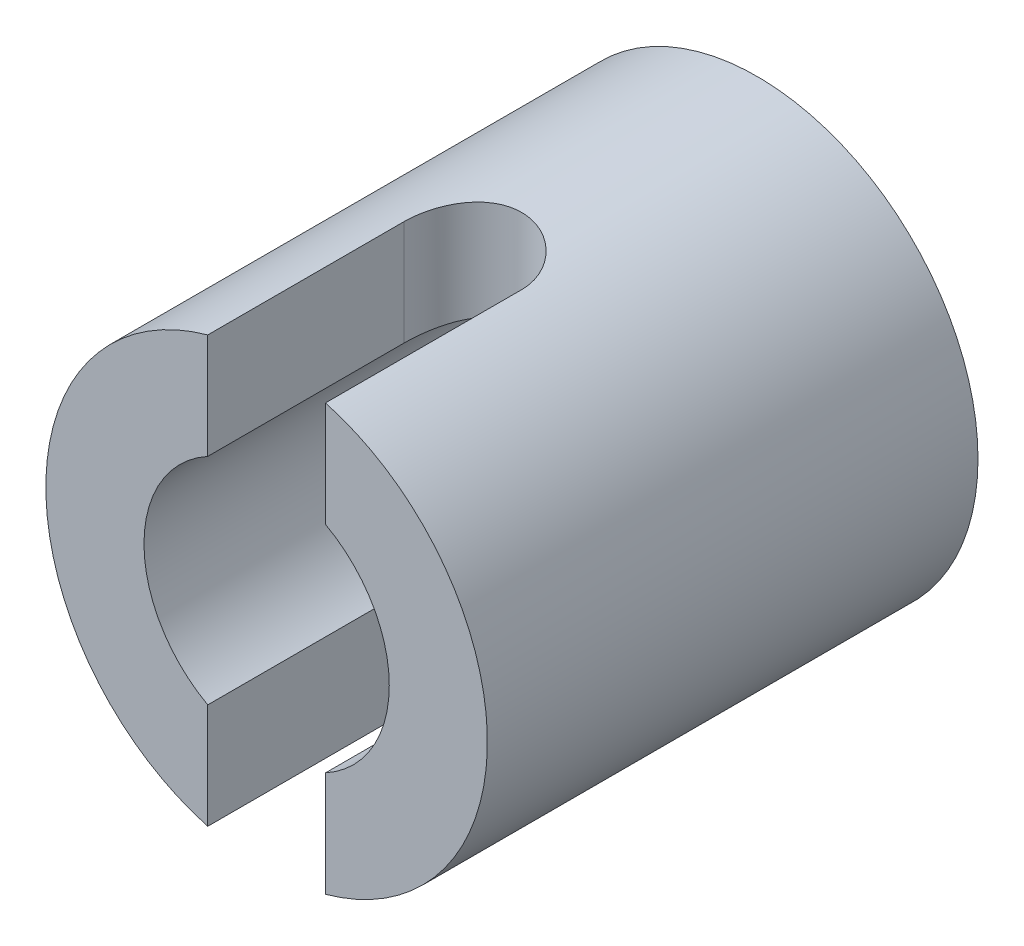
ISO-10303-21;
HEADER;
FILE_DESCRIPTION(('STEP AP214'),'2;1');
FILE_NAME('part.step','',(''),(''),'','','');
FILE_SCHEMA(('AUTOMOTIVE_DESIGN { 1 0 10303 214 1 1 1 1 }'));
ENDSEC;
DATA;
#1=APPLICATION_CONTEXT('core data for automotive mechanical design processes');
#2=APPLICATION_PROTOCOL_DEFINITION('international standard','automotive_design',2000,#1);
#3=PRODUCT_CONTEXT('',#1,'mechanical');
#4=PRODUCT('Part','Part','',(#3));
#5=PRODUCT_RELATED_PRODUCT_CATEGORY('part','',(#4));
#6=PRODUCT_DEFINITION_FORMATION('','',#4);
#7=PRODUCT_DEFINITION_CONTEXT('part definition',#1,'design');
#8=PRODUCT_DEFINITION('design','',#6,#7);
#9=PRODUCT_DEFINITION_SHAPE('','',#8);
#10=(LENGTH_UNIT() NAMED_UNIT(*) SI_UNIT(.MILLI.,.METRE.));
#11=(NAMED_UNIT(*) PLANE_ANGLE_UNIT() SI_UNIT($,.RADIAN.));
#12=(NAMED_UNIT(*) SI_UNIT($,.STERADIAN.) SOLID_ANGLE_UNIT());
#13=UNCERTAINTY_MEASURE_WITH_UNIT(LENGTH_MEASURE(1.E-05),#10,'distance_accuracy_value','');
#14=(GEOMETRIC_REPRESENTATION_CONTEXT(3) GLOBAL_UNCERTAINTY_ASSIGNED_CONTEXT((#13)) GLOBAL_UNIT_ASSIGNED_CONTEXT((#10,
#11,#12)) REPRESENTATION_CONTEXT('',''));
#15=CARTESIAN_POINT('',(0.,0.,0.));
#16=DIRECTION('',(0.,0.,1.));
#17=DIRECTION('',(1.,0.,0.));
#18=AXIS2_PLACEMENT_3D('',#15,#16,#17);
#19=CARTESIAN_POINT('',(0.,0.,50.));
#20=DIRECTION('',(0.,0.,1.));
#21=DIRECTION('',(1.,0.,0.));
#22=AXIS2_PLACEMENT_3D('',#19,#20,#21);
#23=PLANE('',#22);
#24=DIRECTION('',(0.,1.,0.));
#25=VECTOR('',#24,1.);
#26=CARTESIAN_POINT('',(6.,-22.5,50.));
#27=LINE('',#26,#25);
#28=CARTESIAN_POINT('',(6.,-21.6852484422014,50.));
#29=VERTEX_POINT('',#28);
#30=CARTESIAN_POINT('',(6.,-10.9658560997307,50.));
#31=VERTEX_POINT('',#30);
#32=EDGE_CURVE('E138',#29,#31,#27,.T.);
#33=ORIENTED_EDGE('',*,*,#32,.F.);
#34=CARTESIAN_POINT('',(0.,0.,50.));
#35=DIRECTION('',(0.,0.,1.));
#36=DIRECTION('',(1.,0.,0.));
#37=AXIS2_PLACEMENT_3D('',#34,#35,#36);
#38=CIRCLE('',#37,22.5);
#39=CARTESIAN_POINT('',(6.,21.6852484422014,50.));
#40=VERTEX_POINT('',#39);
#41=EDGE_CURVE('E122',#29,#40,#38,.T.);
#42=ORIENTED_EDGE('',*,*,#41,.T.);
#43=CARTESIAN_POINT('',(6.,10.9658560997306,50.));
#44=VERTEX_POINT('',#43);
#45=EDGE_CURVE('E137',#44,#40,#27,.T.);
#46=ORIENTED_EDGE('',*,*,#45,.F.);
#47=CARTESIAN_POINT('',(0.,0.,50.));
#48=DIRECTION('',(0.,0.,1.));
#49=DIRECTION('',(1.,0.,0.));
#50=AXIS2_PLACEMENT_3D('',#47,#48,#49);
#51=CIRCLE('',#50,12.5);
#52=EDGE_CURVE('E128',#31,#44,#51,.T.);
#53=ORIENTED_EDGE('',*,*,#52,.F.);
#54=EDGE_LOOP('',(#33,#42,#46,#53));
#55=FACE_BOUND('',#54,.T.);
#56=ADVANCED_FACE('F33',(#55),#23,.T.);
#57=CARTESIAN_POINT('',(0.,0.,50.));
#58=DIRECTION('',(0.,0.,-1.));
#59=DIRECTION('',(-1.,0.,0.));
#60=AXIS2_PLACEMENT_3D('',#57,#58,#59);
#61=CYLINDRICAL_SURFACE('',#60,12.5);
#62=DIRECTION('',(0.,0.,-1.));
#63=VECTOR('',#62,1.);
#64=CARTESIAN_POINT('',(6.,10.9658560997307,50.));
#65=LINE('',#64,#63);
#66=CARTESIAN_POINT('',(6.,10.9658560997306,30.));
#67=VERTEX_POINT('',#66);
#68=EDGE_CURVE('E179',#67,#44,#65,.F.);
#69=ORIENTED_EDGE('',*,*,#68,.F.);
#70=CARTESIAN_POINT('',(-6.,10.9658560997307,30.));
#71=CARTESIAN_POINT('',(-6.00002865948876,10.9658119468546,29.8419259882187));
#72=CARTESIAN_POINT('',(-5.99375451599358,10.9692726606811,29.6838722207561));
#73=CARTESIAN_POINT('',(-5.96881948529984,10.9828758236465,29.3691201890522));
#74=CARTESIAN_POINT('',(-5.95016553132486,10.9930145327984,29.2124212158005));
#75=CARTESIAN_POINT('',(-5.90082132025954,11.0195753009746,28.9023437710375));
#76=CARTESIAN_POINT('',(-5.87019583069381,11.0359635377871,28.7489520415639));
#77=CARTESIAN_POINT('',(-5.79727964022485,11.0744416185969,28.4456930546913));
#78=CARTESIAN_POINT('',(-5.75498774819269,11.0965320447675,28.295826158871));
#79=CARTESIAN_POINT('',(-5.65928588338995,11.1456431526631,28.0008837379133));
#80=CARTESIAN_POINT('',(-5.60589997779659,11.1726531465412,27.8557986159035));
#81=CARTESIAN_POINT('',(-5.48844655650736,11.2308170083332,27.570857421723));
#82=CARTESIAN_POINT('',(-5.42437498297044,11.2619724495526,27.4310033608221));
#83=CARTESIAN_POINT('',(-5.21673068965311,11.3604221644973,27.0200913822479));
#84=CARTESIAN_POINT('',(-5.05777011280692,11.4326773866541,26.7578109858411));
#85=CARTESIAN_POINT('',(-4.68966781990349,11.5887834599461,26.2430458659001));
#86=CARTESIAN_POINT('',(-4.47765588198519,11.6730975702765,25.9927726188625));
#87=CARTESIAN_POINT('',(-4.0152237486199,11.8401113873892,25.5295510788278));
#88=CARTESIAN_POINT('',(-3.7647937607855,11.9228106764937,25.3166123317687));
#89=CARTESIAN_POINT('',(-3.35614083480019,12.0419362088833,25.0233721116099));
#90=CARTESIAN_POINT('',(-3.2097372670948,12.0818783561493,24.9276924078461));
#91=CARTESIAN_POINT('',(-2.90840720483191,12.1579299817597,24.7491148567846));
#92=CARTESIAN_POINT('',(-2.7534840912193,12.1940409640563,24.6662119880169));
#93=CARTESIAN_POINT('',(-2.43612856249136,12.2613862568141,24.5139950145194));
#94=CARTESIAN_POINT('',(-2.27369783359533,12.2926216555049,24.4446778765708));
#95=CARTESIAN_POINT('',(-1.94246125709469,12.3492939056924,24.32037652835));
#96=CARTESIAN_POINT('',(-1.77365602769168,12.3747313178053,24.2653909322651));
#97=CARTESIAN_POINT('',(-1.44241298474884,12.4175463274212,24.1735953170178));
#98=CARTESIAN_POINT('',(-1.28029686698486,12.4353470131061,24.1358207085291));
#99=CARTESIAN_POINT('',(-0.952942552143283,12.4647060329977,24.0738170536926));
#100=CARTESIAN_POINT('',(-0.787704633331255,12.4762649208831,24.0495868058857));
#101=CARTESIAN_POINT('',(-0.455526503518669,12.4928034709928,24.0149879253022));
#102=CARTESIAN_POINT('',(-0.288587045513751,12.4977859261428,24.0046134081542));
#103=CARTESIAN_POINT('',(0.0456365201175944,12.5010335468412,23.9978462171405));
#104=CARTESIAN_POINT('',(0.212920608276951,12.499299081943,24.0014527740601));
#105=CARTESIAN_POINT('',(0.532947813693255,12.4895756225528,24.0217421262803));
#106=CARTESIAN_POINT('',(0.685776369621211,12.4821019192957,24.0373477386514));
#107=CARTESIAN_POINT('',(0.989480202310237,12.4617052363773,24.0801644991114));
#108=CARTESIAN_POINT('',(1.14035484215988,12.4487805237681,24.1073793379583));
#109=CARTESIAN_POINT('',(1.43902115494811,12.4177998497615,24.1731147223819));
#110=CARTESIAN_POINT('',(1.58681389499011,12.3997456971891,24.2116312827215));
#111=CARTESIAN_POINT('',(1.87849130687656,12.3589226810899,24.299606387742));
#112=CARTESIAN_POINT('',(2.02237446054318,12.3361520148184,24.3490691167609));
#113=CARTESIAN_POINT('',(2.30734949017449,12.2860634503394,24.4592600998468));
#114=CARTESIAN_POINT('',(2.44837311723189,12.258685800032,24.5201377765698));
#115=CARTESIAN_POINT('',(2.72474698441202,12.2002354444059,24.6521741768075));
#116=CARTESIAN_POINT('',(2.86009514569277,12.1691614008679,24.7233366257737));
#117=CARTESIAN_POINT('',(3.25656885919491,12.0713983664922,24.9514744426594));
#118=CARTESIAN_POINT('',(3.50829157931999,12.0001377326273,25.1231657443195));
#119=CARTESIAN_POINT('',(4.00278534575974,11.8448666981681,25.5181762319337));
#120=CARTESIAN_POINT('',(4.24277625794339,11.7602860392511,25.7447262232682));
#121=CARTESIAN_POINT('',(4.68293947649583,11.5920500033531,26.2345756503236));
#122=CARTESIAN_POINT('',(4.88308054052515,11.5083954005457,26.4979036470218));
#123=CARTESIAN_POINT('',(5.15450298754663,11.3882251329188,26.9240180679913));
#124=CARTESIAN_POINT('',(5.2420440990787,11.3480829170677,27.0756594241728));
#125=CARTESIAN_POINT('',(5.40388301696457,11.2719134545959,27.3868108132584));
#126=CARTESIAN_POINT('',(5.47818664143396,11.2358844026786,27.5463173497191));
#127=CARTESIAN_POINT('',(5.61270091926787,11.1692983255289,27.8719566427071));
#128=CARTESIAN_POINT('',(5.67293484246025,11.138732284994,28.0380779186946));
#129=CARTESIAN_POINT('',(5.77872158663383,11.084219027667,28.3758985142118));
#130=CARTESIAN_POINT('',(5.82428083282873,11.0602689147891,28.5475953561667));
#131=CARTESIAN_POINT('',(5.90773031960751,11.0159628213759,28.9302687735291));
#132=CARTESIAN_POINT('',(5.94223918656033,10.9972964956355,29.1422046931604));
#133=CARTESIAN_POINT('',(5.97684365134823,10.9785011938486,29.462484771451));
#134=CARTESIAN_POINT('',(5.98551871669007,10.9737700439536,29.5697158332003));
#135=CARTESIAN_POINT('',(5.99709865291582,10.9674441650941,29.7846209630894));
#136=CARTESIAN_POINT('',(6.00000137642852,10.9658506033473,29.8922951811672));
#137=CARTESIAN_POINT('',(6.,10.9658560997307,30.));
#138=B_SPLINE_CURVE_WITH_KNOTS('',3,(#70,#71,#72,#73,#74,#75,#76,#77,#78,#79,#80,#81,#82,#83,
#84,#85,#86,#87,#88,#89,#90,#91,#92,#93,#94,#95,#96,#97,#98,#99,#100,#101,#102,#103,#104,#105,
#106,#107,#108,#109,#110,#111,#112,#113,#114,#115,#116,#117,#118,#119,#120,#121,#122,#123,#124,
#125,#126,#127,#128,#129,#130,#131,#132,#133,#134,#135,#136,#137),.UNSPECIFIED.,.F.,.F.,(4,2,2,
2,2,2,2,2,2,2,2,2,2,2,2,2,2,2,2,2,2,2,2,2,2,2,2,2,2,2,2,2,2,4),(0.,0.474027754495679,
0.947790256942222,1.41902434917404,1.89030657179063,2.36057688020514,2.83102618028441,
3.77232778554664,4.7842552393999,5.79644105359859,6.33405613251356,6.87145937959838,
7.40874250630249,7.94597366022063,8.44752474430664,8.94903133099696,9.45032486574069,
9.95159082057141,10.4124617634167,10.8734793337998,11.3343345341506,11.7953662085948,
12.2629176975072,12.7306389739876,13.6655389236668,14.6834628863175,15.7021817873902,
16.2405100712385,16.7786011631659,17.3157959052474,17.8527551192991,18.4976279333002,
18.8205113672206,19.143514894684),.UNSPECIFIED.);
#139=CARTESIAN_POINT('',(-6.,10.9658560997306,30.));
#140=VERTEX_POINT('',#139);
#141=EDGE_CURVE('E134',#140,#67,#138,.T.);
#142=ORIENTED_EDGE('',*,*,#141,.F.);
#143=DIRECTION('',(0.,0.,-1.));
#144=VECTOR('',#143,1.);
#145=CARTESIAN_POINT('',(-6.,10.9658560997307,50.));
#146=LINE('',#145,#144);
#147=CARTESIAN_POINT('',(-6.,10.9658560997306,50.));
#148=VERTEX_POINT('',#147);
#149=EDGE_CURVE('E193',#148,#140,#146,.T.);
#150=ORIENTED_EDGE('',*,*,#149,.F.);
#151=CARTESIAN_POINT('',(-6.,-10.9658560997307,50.));
#152=VERTEX_POINT('',#151);
#153=EDGE_CURVE('E125',#148,#152,#51,.T.);
#154=ORIENTED_EDGE('',*,*,#153,.T.);
#155=DIRECTION('',(0.,0.,-1.));
#156=VECTOR('',#155,1.);
#157=CARTESIAN_POINT('',(-6.,-10.9658560997307,50.));
#158=LINE('',#157,#156);
#159=CARTESIAN_POINT('',(-6.,-10.9658560997307,30.));
#160=VERTEX_POINT('',#159);
#161=EDGE_CURVE('E61',#160,#152,#158,.F.);
#162=ORIENTED_EDGE('',*,*,#161,.F.);
#163=CARTESIAN_POINT('',(6.,-10.9658560997307,30.));
#164=CARTESIAN_POINT('',(6.00002865948876,-10.9658119468546,29.8419259882187));
#165=CARTESIAN_POINT('',(5.99375451599358,-10.9692726606811,29.6838722207561));
#166=CARTESIAN_POINT('',(5.96881948529984,-10.9828758236465,29.3691201890522));
#167=CARTESIAN_POINT('',(5.95016553132486,-10.9930145327984,29.2124212158005));
#168=CARTESIAN_POINT('',(5.90082132025954,-11.0195753009746,28.9023437710375));
#169=CARTESIAN_POINT('',(5.87019583069381,-11.0359635377871,28.7489520415639));
#170=CARTESIAN_POINT('',(5.79727964022485,-11.0744416185969,28.4456930546913));
#171=CARTESIAN_POINT('',(5.75498774819269,-11.0965320447675,28.295826158871));
#172=CARTESIAN_POINT('',(5.65928588338994,-11.1456431526631,28.0008837379133));
#173=CARTESIAN_POINT('',(5.60589997779659,-11.1726531465412,27.8557986159035));
#174=CARTESIAN_POINT('',(5.48844655650736,-11.2308170083332,27.570857421723));
#175=CARTESIAN_POINT('',(5.42437498297043,-11.2619724495526,27.4310033608221));
#176=CARTESIAN_POINT('',(5.2167306896531,-11.3604221644973,27.0200913822479));
#177=CARTESIAN_POINT('',(5.05777011280691,-11.4326773866541,26.7578109858411));
#178=CARTESIAN_POINT('',(4.68966781990349,-11.5887834599461,26.2430458659001));
#179=CARTESIAN_POINT('',(4.47765588198518,-11.6730975702765,25.9927726188625));
#180=CARTESIAN_POINT('',(4.0152237486199,-11.8401113873892,25.5295510788278));
#181=CARTESIAN_POINT('',(3.76479376078549,-11.9228106764937,25.3166123317687));
#182=CARTESIAN_POINT('',(3.35614083480019,-12.0419362088833,25.0233721116099));
#183=CARTESIAN_POINT('',(3.2097372670948,-12.0818783561493,24.9276924078461));
#184=CARTESIAN_POINT('',(2.90840720483191,-12.1579299817597,24.7491148567846));
#185=CARTESIAN_POINT('',(2.7534840912193,-12.1940409640564,24.6662119880169));
#186=CARTESIAN_POINT('',(2.43612856249135,-12.2613862568142,24.5139950145194));
#187=CARTESIAN_POINT('',(2.27369783359533,-12.2926216555049,24.4446778765708));
#188=CARTESIAN_POINT('',(1.94246125709468,-12.3492939056924,24.32037652835));
#189=CARTESIAN_POINT('',(1.77365602769167,-12.3747313178053,24.2653909322651));
#190=CARTESIAN_POINT('',(1.44241298474883,-12.4175463274212,24.1735953170178));
#191=CARTESIAN_POINT('',(1.28029686698485,-12.4353470131061,24.1358207085291));
#192=CARTESIAN_POINT('',(0.952942552143276,-12.4647060329977,24.0738170536926));
#193=CARTESIAN_POINT('',(0.787704633331248,-12.4762649208831,24.0495868058857));
#194=CARTESIAN_POINT('',(0.455526503518662,-12.4928034709928,24.0149879253022));
#195=CARTESIAN_POINT('',(0.288587045513744,-12.4977859261428,24.0046134081542));
#196=CARTESIAN_POINT('',(-0.0456365201176016,-12.5010335468412,23.9978462171405));
#197=CARTESIAN_POINT('',(-0.212920608276958,-12.499299081943,24.0014527740601));
#198=CARTESIAN_POINT('',(-0.532947813693262,-12.4895756225528,24.0217421262803));
#199=CARTESIAN_POINT('',(-0.685776369621217,-12.4821019192957,24.0373477386514));
#200=CARTESIAN_POINT('',(-0.989480202310242,-12.4617052363773,24.0801644991114));
#201=CARTESIAN_POINT('',(-1.14035484215989,-12.4487805237681,24.1073793379583));
#202=CARTESIAN_POINT('',(-1.43902115494811,-12.4177998497615,24.1731147223819));
#203=CARTESIAN_POINT('',(-1.58681389499012,-12.3997456971891,24.2116312827215));
#204=CARTESIAN_POINT('',(-1.87849130687657,-12.3589226810899,24.299606387742));
#205=CARTESIAN_POINT('',(-2.02237446054319,-12.3361520148184,24.3490691167609));
#206=CARTESIAN_POINT('',(-2.3073494901745,-12.2860634503394,24.4592600998468));
#207=CARTESIAN_POINT('',(-2.4483731172319,-12.258685800032,24.5201377765698));
#208=CARTESIAN_POINT('',(-2.72474698441202,-12.2002354444059,24.6521741768075));
#209=CARTESIAN_POINT('',(-2.86009514569277,-12.1691614008679,24.7233366257737));
#210=CARTESIAN_POINT('',(-3.25656885919492,-12.0713983664922,24.9514744426594));
#211=CARTESIAN_POINT('',(-3.50829157931999,-12.0001377326273,25.1231657443195));
#212=CARTESIAN_POINT('',(-4.00278534575974,-11.8448666981681,25.5181762319337));
#213=CARTESIAN_POINT('',(-4.24277625794339,-11.7602860392511,25.7447262232682));
#214=CARTESIAN_POINT('',(-4.68293947649583,-11.5920500033531,26.2345756503236));
#215=CARTESIAN_POINT('',(-4.88308054052515,-11.5083954005457,26.4979036470218));
#216=CARTESIAN_POINT('',(-5.15450298754663,-11.3882251329188,26.9240180679913));
#217=CARTESIAN_POINT('',(-5.2420440990787,-11.3480829170677,27.0756594241728));
#218=CARTESIAN_POINT('',(-5.40388301696457,-11.2719134545959,27.3868108132584));
#219=CARTESIAN_POINT('',(-5.47818664143396,-11.2358844026786,27.5463173497191));
#220=CARTESIAN_POINT('',(-5.61270091926787,-11.1692983255289,27.8719566427071));
#221=CARTESIAN_POINT('',(-5.67293484246025,-11.138732284994,28.0380779186946));
#222=CARTESIAN_POINT('',(-5.77872158663383,-11.084219027667,28.3758985142118));
#223=CARTESIAN_POINT('',(-5.82428083282873,-11.0602689147891,28.5475953561667));
#224=CARTESIAN_POINT('',(-5.90773031960751,-11.0159628213759,28.9302687735291));
#225=CARTESIAN_POINT('',(-5.94223918656033,-10.9972964956355,29.1422046931604));
#226=CARTESIAN_POINT('',(-5.97684365134824,-10.9785011938486,29.462484771451));
#227=CARTESIAN_POINT('',(-5.98551871669007,-10.9737700439536,29.5697158332003));
#228=CARTESIAN_POINT('',(-5.99709865291582,-10.9674441650941,29.7846209630894));
#229=CARTESIAN_POINT('',(-6.00000137642852,-10.9658506033473,29.8922951811672));
#230=CARTESIAN_POINT('',(-6.,-10.9658560997307,30.));
#231=B_SPLINE_CURVE_WITH_KNOTS('',3,(#163,#164,#165,#166,#167,#168,#169,#170,#171,#172,#173,
#174,#175,#176,#177,#178,#179,#180,#181,#182,#183,#184,#185,#186,#187,#188,#189,#190,#191,#192,
#193,#194,#195,#196,#197,#198,#199,#200,#201,#202,#203,#204,#205,#206,#207,#208,#209,#210,#211,
#212,#213,#214,#215,#216,#217,#218,#219,#220,#221,#222,#223,#224,#225,#226,#227,#228,#229,#230),
.UNSPECIFIED.,.F.,.F.,(4,2,2,2,2,2,2,2,2,2,2,2,2,2,2,2,2,2,2,2,2,2,2,2,2,2,2,2,2,2,2,2,2,4),(0.,
0.474027754495679,0.947790256942222,1.41902434917404,1.89030657179064,2.36057688020514,
2.83102618028442,3.77232778554665,4.78425523939991,5.7964410535986,6.33405613251357,
6.87145937959839,7.4087425063025,7.94597366022064,8.44752474430665,8.94903133099696,
9.45032486574069,9.95159082057142,10.4124617634167,10.8734793337998,11.3343345341506,
11.7953662085948,12.2629176975072,12.7306389739876,13.6655389236668,14.6834628863175,
15.7021817873902,16.2405100712385,16.7786011631659,17.3157959052473,17.8527551192991,
18.4976279333002,18.8205113672206,19.143514894684),.UNSPECIFIED.);
#232=CARTESIAN_POINT('',(6.,-10.9658560997307,30.));
#233=VERTEX_POINT('',#232);
#234=EDGE_CURVE('E159',#233,#160,#231,.T.);
#235=ORIENTED_EDGE('',*,*,#234,.F.);
#236=DIRECTION('',(0.,0.,-1.));
#237=VECTOR('',#236,1.);
#238=CARTESIAN_POINT('',(6.,-10.9658560997307,50.));
#239=LINE('',#238,#237);
#240=EDGE_CURVE('E164',#31,#233,#239,.T.);
#241=ORIENTED_EDGE('',*,*,#240,.F.);
#242=ORIENTED_EDGE('',*,*,#52,.T.);
#243=EDGE_LOOP('',(#69,#142,#150,#154,#162,#235,#241,#242));
#244=FACE_BOUND('',#243,.T.);
#245=CARTESIAN_POINT('',(0.,0.,0.));
#246=DIRECTION('',(0.,0.,1.));
#247=DIRECTION('',(1.,0.,0.));
#248=AXIS2_PLACEMENT_3D('',#245,#246,#247);
#249=CIRCLE('',#248,12.5);
#250=CARTESIAN_POINT('',(12.5,0.,0.));
#251=VERTEX_POINT('',#250);
#252=EDGE_CURVE('E130',#251,#251,#249,.T.);
#253=ORIENTED_EDGE('',*,*,#252,.F.);
#254=EDGE_LOOP('',(#253));
#255=FACE_BOUND('',#254,.T.);
#256=ADVANCED_FACE('F35',(#244,#255),#61,.F.);
#257=CARTESIAN_POINT('',(0.,0.,50.));
#258=DIRECTION('',(0.,0.,-1.));
#259=DIRECTION('',(-1.,0.,0.));
#260=AXIS2_PLACEMENT_3D('',#257,#258,#259);
#261=CYLINDRICAL_SURFACE('',#260,22.5);
#262=DIRECTION('',(0.,0.,-1.));
#263=VECTOR('',#262,1.);
#264=CARTESIAN_POINT('',(6.,-21.6852484422014,50.));
#265=LINE('',#264,#263);
#266=CARTESIAN_POINT('',(6.,-21.6852484422014,30.));
#267=VERTEX_POINT('',#266);
#268=EDGE_CURVE('E189',#29,#267,#265,.T.);
#269=ORIENTED_EDGE('',*,*,#268,.T.);
#270=CARTESIAN_POINT('',(6.,-21.6852484422014,30.));
#271=CARTESIAN_POINT('',(6.00002143757072,-21.6852278454503,29.8344657481758));
#272=CARTESIAN_POINT('',(5.99315056555718,-21.6871431547269,29.6689387735071));
#273=CARTESIAN_POINT('',(5.96578222072956,-21.6946955183995,29.3391304628435));
#274=CARTESIAN_POINT('',(5.94528727869301,-21.7003318815793,29.1748489012347));
#275=CARTESIAN_POINT('',(5.89088722832448,-21.7151604368289,28.8490506251658));
#276=CARTESIAN_POINT('',(5.85701103724506,-21.7243449602904,28.6875287271007));
#277=CARTESIAN_POINT('',(5.77614189060431,-21.7459869107053,28.3680268504027));
#278=CARTESIAN_POINT('',(5.7291487046661,-21.7584443951422,28.210046934031));
#279=CARTESIAN_POINT('',(5.62244844449365,-21.7862595557273,27.898778157833));
#280=CARTESIAN_POINT('',(5.5627464521228,-21.8016160723642,27.7454874508741));
#281=CARTESIAN_POINT('',(5.43105556556831,-21.8347943803512,27.4444899712217));
#282=CARTESIAN_POINT('',(5.35906211000339,-21.8526170864411,27.2967852964598));
#283=CARTESIAN_POINT('',(5.20333662362518,-21.8902192755553,27.0079769568008));
#284=CARTESIAN_POINT('',(5.11960543026253,-21.9099986189501,26.866872821933));
#285=CARTESIAN_POINT('',(4.94094856899288,-21.9509778091758,26.5920834362246));
#286=CARTESIAN_POINT('',(4.84601867880679,-21.9721781904758,26.4584010117305));
#287=CARTESIAN_POINT('',(4.64340207624226,-22.0158985883613,26.1964708900077));
#288=CARTESIAN_POINT('',(4.53547997934762,-22.0384374065116,26.0684083582649));
#289=CARTESIAN_POINT('',(4.30929768656988,-22.0837781774897,25.821726781896));
#290=CARTESIAN_POINT('',(4.19103366661629,-22.1065802249221,25.7031112616757));
#291=CARTESIAN_POINT('',(3.94499167074771,-22.151809846686,25.4761692828282));
#292=CARTESIAN_POINT('',(3.81721561547063,-22.1742374955011,25.3678407570841));
#293=CARTESIAN_POINT('',(3.55289974711594,-22.218119949707,25.1621328677686));
#294=CARTESIAN_POINT('',(3.41635672280239,-22.2395743936573,25.0647575525824));
#295=CARTESIAN_POINT('',(3.13322318752662,-22.2812410504668,24.8802431997376));
#296=CARTESIAN_POINT('',(2.9865086519568,-22.3014284934186,24.793288724999));
#297=CARTESIAN_POINT('',(2.68592829952507,-22.3396227826505,24.6320500967334));
#298=CARTESIAN_POINT('',(2.5320597988738,-22.3576288012916,24.5577707478492));
#299=CARTESIAN_POINT('',(2.21838371765237,-22.3909274486183,24.4225520151942));
#300=CARTESIAN_POINT('',(2.05857945457784,-22.4062215661867,24.3616053072395));
#301=CARTESIAN_POINT('',(1.73404500550142,-22.4336713831201,24.2534924223287));
#302=CARTESIAN_POINT('',(1.56931308784671,-22.4458259643973,24.2063311540168));
#303=CARTESIAN_POINT('',(1.24005619019484,-22.4663935206214,24.1271586625682));
#304=CARTESIAN_POINT('',(1.07561422327453,-22.4748863939196,24.0948228306116));
#305=CARTESIAN_POINT('',(0.744456504527514,-22.4882912356254,24.0440076424904));
#306=CARTESIAN_POINT('',(0.577740761466934,-22.4932032178345,24.0255282329203));
#307=CARTESIAN_POINT('',(0.243301077122261,-22.4993060509493,24.002592620523));
#308=CARTESIAN_POINT('',(0.0755772690246396,-22.500497383054,23.9981346042814));
#309=CARTESIAN_POINT('',(-0.259638241418141,-22.4991261882436,24.0032770804847));
#310=CARTESIAN_POINT('',(-0.42712994670412,-22.4965637093341,24.0128773931451));
#311=CARTESIAN_POINT('',(-0.756407114123262,-22.4878697933301,24.0456294902287));
#312=CARTESIAN_POINT('',(-0.918229819656835,-22.481830177055,24.0684327101634));
#313=CARTESIAN_POINT('',(-1.23932087464832,-22.4664175641162,24.1271200346061));
#314=CARTESIAN_POINT('',(-1.39858926236569,-22.4570446174291,24.1630039429955));
#315=CARTESIAN_POINT('',(-1.7135065587437,-22.4352137308963,24.2475672702987));
#316=CARTESIAN_POINT('',(-1.86915475031831,-22.4227551854552,24.2962492011335));
#317=CARTESIAN_POINT('',(-2.17570551000697,-22.3950884203608,24.4060029933642));
#318=CARTESIAN_POINT('',(-2.32660963476587,-22.3798811139353,24.4670707406092));
#319=CARTESIAN_POINT('',(-2.62427084456351,-22.3469428831416,24.6018366665011));
#320=CARTESIAN_POINT('',(-2.77096937273041,-22.3291876297757,24.6756581979149));
#321=CARTESIAN_POINT('',(-3.05758902729823,-22.2917481176719,24.8349229916975));
#322=CARTESIAN_POINT('',(-3.19751240266911,-22.2720645056915,24.9203623612322));
#323=CARTESIAN_POINT('',(-3.46982739642779,-22.231267729594,25.1023343954026));
#324=CARTESIAN_POINT('',(-3.60221530664343,-22.2101538726621,25.1988724522902));
#325=CARTESIAN_POINT('',(-3.85852742029929,-22.1670623307285,25.4023341163944));
#326=CARTESIAN_POINT('',(-3.98245442062933,-22.1450849350055,25.5092542630568));
#327=CARTESIAN_POINT('',(-4.22483789945815,-22.100144944171,25.7362966744966));
#328=CARTESIAN_POINT('',(-4.34300571313122,-22.0771729277197,25.8567254470798));
#329=CARTESIAN_POINT('',(-4.56877156178869,-22.0315589266685,26.10709226248));
#330=CARTESIAN_POINT('',(-4.67637327905837,-22.0089168294511,26.2370269647348));
#331=CARTESIAN_POINT('',(-4.88039540260501,-21.9645771459455,26.5056889443041));
#332=CARTESIAN_POINT('',(-4.97680836164839,-21.9428801946784,26.6444219838755));
#333=CARTESIAN_POINT('',(-5.15765441490612,-21.9010779321969,26.9296411789587));
#334=CARTESIAN_POINT('',(-5.24209215086456,-21.880972005625,27.0761243000468));
#335=CARTESIAN_POINT('',(-5.39896362810512,-21.8427964996012,27.3769906870099));
#336=CARTESIAN_POINT('',(-5.47130742687725,-21.8247424722397,27.5314228612134));
#337=CARTESIAN_POINT('',(-5.60264941366641,-21.7913953656777,27.8460799890178));
#338=CARTESIAN_POINT('',(-5.66165296998811,-21.7761011763808,28.0063025822579));
#339=CARTESIAN_POINT('',(-5.76579957731218,-21.7487575628776,28.3312763181996));
#340=CARTESIAN_POINT('',(-5.81095701352758,-21.7367047726812,28.4960225658418));
#341=CARTESIAN_POINT('',(-5.88707843694107,-21.7162118913142,28.8289135827844));
#342=CARTESIAN_POINT('',(-5.9180490391929,-21.7077701165167,28.997056729909));
#343=CARTESIAN_POINT('',(-5.96117055714157,-21.6959642342755,29.3043763773761));
#344=CARTESIAN_POINT('',(-5.97573473753105,-21.691951910821,29.4431945894639));
#345=CARTESIAN_POINT('',(-5.99514636408284,-21.6865912402654,29.7213381096254));
#346=CARTESIAN_POINT('',(-6.00000917841481,-21.6852386798178,29.8606622648436));
#347=CARTESIAN_POINT('',(-6.,-21.6852484422014,30.));
#348=B_SPLINE_CURVE_WITH_KNOTS('',3,(#270,#271,#272,#273,#274,#275,#276,#277,#278,#279,#280,
#281,#282,#283,#284,#285,#286,#287,#288,#289,#290,#291,#292,#293,#294,#295,#296,#297,#298,#299,
#300,#301,#302,#303,#304,#305,#306,#307,#308,#309,#310,#311,#312,#313,#314,#315,#316,#317,#318,
#319,#320,#321,#322,#323,#324,#325,#326,#327,#328,#329,#330,#331,#332,#333,#334,#335,#336,#337,
#338,#339,#340,#341,#342,#343,#344,#345,#346,#347),.UNSPECIFIED.,.F.,.F.,(4,2,2,2,2,2,2,2,2,2,2,
2,2,2,2,2,2,2,2,2,2,2,2,2,2,2,2,2,2,2,2,2,2,2,2,2,2,2,4),(0.,0.49643800631708,0.992783821152776,
1.48806283603287,1.98335055016238,2.47844058465413,2.97371474878541,3.46895359463208,
3.96437976229343,4.47074463372757,4.97729753881908,5.48374843845111,5.99038591512974,
6.5049719334835,7.01975257997211,7.53424972154362,8.04892983990636,8.55172844556787,
9.05452511333002,9.55725675073325,10.0599819590255,10.5500037204309,11.0400181352513,
11.5301287991346,12.0200769306063,12.5150602417612,13.0098781037772,13.5049373951488,
13.9998322363147,14.5100682457398,15.0201258020639,15.5305209286515,16.0407176759102,
16.5545545005479,17.0681841803881,17.5812784101975,18.0941331496774,18.5126928408668,
18.9305889533136),.UNSPECIFIED.);
#349=CARTESIAN_POINT('',(-6.,-21.6852484422014,30.));
#350=VERTEX_POINT('',#349);
#351=EDGE_CURVE('E11',#267,#350,#348,.T.);
#352=ORIENTED_EDGE('',*,*,#351,.T.);
#353=DIRECTION('',(0.,0.,-1.));
#354=VECTOR('',#353,1.);
#355=CARTESIAN_POINT('',(-6.,-21.6852484422014,50.));
#356=LINE('',#355,#354);
#357=CARTESIAN_POINT('',(-6.,-21.6852484422014,50.));
#358=VERTEX_POINT('',#357);
#359=EDGE_CURVE('E105',#350,#358,#356,.F.);
#360=ORIENTED_EDGE('',*,*,#359,.T.);
#361=CARTESIAN_POINT('',(-6.,21.6852484422014,50.));
#362=VERTEX_POINT('',#361);
#363=EDGE_CURVE('E112',#362,#358,#38,.T.);
#364=ORIENTED_EDGE('',*,*,#363,.F.);
#365=DIRECTION('',(0.,0.,-1.));
#366=VECTOR('',#365,1.);
#367=CARTESIAN_POINT('',(-6.,21.6852484422014,50.));
#368=LINE('',#367,#366);
#369=CARTESIAN_POINT('',(-6.,21.6852484422014,30.));
#370=VERTEX_POINT('',#369);
#371=EDGE_CURVE('E53',#362,#370,#368,.T.);
#372=ORIENTED_EDGE('',*,*,#371,.T.);
#373=CARTESIAN_POINT('',(-6.,21.6852484422014,30.));
#374=CARTESIAN_POINT('',(-6.00002143757072,21.6852278454503,29.8344657481758));
#375=CARTESIAN_POINT('',(-5.99315056555718,21.6871431547269,29.6689387735071));
#376=CARTESIAN_POINT('',(-5.96578222072956,21.6946955183995,29.3391304628435));
#377=CARTESIAN_POINT('',(-5.94528727869301,21.7003318815793,29.1748489012347));
#378=CARTESIAN_POINT('',(-5.89088722832448,21.7151604368289,28.8490506251658));
#379=CARTESIAN_POINT('',(-5.85701103724506,21.7243449602904,28.6875287271007));
#380=CARTESIAN_POINT('',(-5.77614189060431,21.7459869107053,28.3680268504027));
#381=CARTESIAN_POINT('',(-5.7291487046661,21.7584443951422,28.210046934031));
#382=CARTESIAN_POINT('',(-5.62244844449365,21.7862595557273,27.898778157833));
#383=CARTESIAN_POINT('',(-5.5627464521228,21.8016160723642,27.7454874508741));
#384=CARTESIAN_POINT('',(-5.43105556556831,21.8347943803512,27.4444899712217));
#385=CARTESIAN_POINT('',(-5.35906211000339,21.8526170864411,27.2967852964598));
#386=CARTESIAN_POINT('',(-5.20333662362518,21.8902192755553,27.0079769568008));
#387=CARTESIAN_POINT('',(-5.11960543026253,21.9099986189501,26.8668728219329));
#388=CARTESIAN_POINT('',(-4.94094856899288,21.9509778091758,26.5920834362246));
#389=CARTESIAN_POINT('',(-4.84601867880679,21.9721781904758,26.4584010117305));
#390=CARTESIAN_POINT('',(-4.64340207624226,22.0158985883613,26.1964708900077));
#391=CARTESIAN_POINT('',(-4.53547997934762,22.0384374065116,26.0684083582649));
#392=CARTESIAN_POINT('',(-4.30929768656989,22.0837781774897,25.821726781896));
#393=CARTESIAN_POINT('',(-4.1910336666163,22.1065802249221,25.7031112616757));
#394=CARTESIAN_POINT('',(-3.94499167074771,22.151809846686,25.4761692828282));
#395=CARTESIAN_POINT('',(-3.81721561547063,22.1742374955011,25.3678407570841));
#396=CARTESIAN_POINT('',(-3.55289974711595,22.218119949707,25.1621328677686));
#397=CARTESIAN_POINT('',(-3.41635672280239,22.2395743936573,25.0647575525824));
#398=CARTESIAN_POINT('',(-3.13322318752662,22.2812410504668,24.8802431997376));
#399=CARTESIAN_POINT('',(-2.9865086519568,22.3014284934186,24.793288724999));
#400=CARTESIAN_POINT('',(-2.68592829952507,22.3396227826505,24.6320500967334));
#401=CARTESIAN_POINT('',(-2.53205979887381,22.3576288012916,24.5577707478492));
#402=CARTESIAN_POINT('',(-2.21838371765238,22.3909274486183,24.4225520151942));
#403=CARTESIAN_POINT('',(-2.05857945457784,22.4062215661867,24.3616053072395));
#404=CARTESIAN_POINT('',(-1.73404500550143,22.4336713831201,24.2534924223287));
#405=CARTESIAN_POINT('',(-1.56931308784671,22.4458259643973,24.2063311540168));
#406=CARTESIAN_POINT('',(-1.24005619019485,22.4663935206214,24.1271586625682));
#407=CARTESIAN_POINT('',(-1.07561422327453,22.4748863939196,24.0948228306116));
#408=CARTESIAN_POINT('',(-0.744456504527516,22.4882912356254,24.0440076424904));
#409=CARTESIAN_POINT('',(-0.577740761466936,22.4932032178345,24.0255282329203));
#410=CARTESIAN_POINT('',(-0.243301077122263,22.4993060509493,24.002592620523));
#411=CARTESIAN_POINT('',(-0.0755772690246415,22.500497383054,23.9981346042814));
#412=CARTESIAN_POINT('',(0.259638241418139,22.4991261882436,24.0032770804847));
#413=CARTESIAN_POINT('',(0.427129946704119,22.4965637093341,24.0128773931451));
#414=CARTESIAN_POINT('',(0.756407114123261,22.4878697933301,24.0456294902287));
#415=CARTESIAN_POINT('',(0.918229819656834,22.481830177055,24.0684327101634));
#416=CARTESIAN_POINT('',(1.23932087464832,22.4664175641162,24.1271200346061));
#417=CARTESIAN_POINT('',(1.39858926236569,22.4570446174291,24.1630039429955));
#418=CARTESIAN_POINT('',(1.7135065587437,22.4352137308963,24.2475672702987));
#419=CARTESIAN_POINT('',(1.86915475031831,22.4227551854552,24.2962492011335));
#420=CARTESIAN_POINT('',(2.17570551000697,22.3950884203608,24.4060029933642));
#421=CARTESIAN_POINT('',(2.32660963476587,22.3798811139353,24.4670707406092));
#422=CARTESIAN_POINT('',(2.62427084456351,22.3469428831416,24.6018366665011));
#423=CARTESIAN_POINT('',(2.77096937273041,22.3291876297757,24.6756581979149));
#424=CARTESIAN_POINT('',(3.05758902729822,22.2917481176719,24.8349229916975));
#425=CARTESIAN_POINT('',(3.19751240266911,22.2720645056915,24.9203623612322));
#426=CARTESIAN_POINT('',(3.46982739642779,22.231267729594,25.1023343954026));
#427=CARTESIAN_POINT('',(3.60221530664343,22.2101538726621,25.1988724522902));
#428=CARTESIAN_POINT('',(3.85852742029929,22.1670623307285,25.4023341163944));
#429=CARTESIAN_POINT('',(3.98245442062933,22.1450849350055,25.5092542630568));
#430=CARTESIAN_POINT('',(4.22483789945815,22.100144944171,25.7362966744966));
#431=CARTESIAN_POINT('',(4.34300571313122,22.0771729277197,25.8567254470798));
#432=CARTESIAN_POINT('',(4.56877156178869,22.0315589266685,26.10709226248));
#433=CARTESIAN_POINT('',(4.67637327905837,22.0089168294511,26.2370269647348));
#434=CARTESIAN_POINT('',(4.88039540260501,21.9645771459455,26.5056889443041));
#435=CARTESIAN_POINT('',(4.97680836164839,21.9428801946784,26.6444219838755));
#436=CARTESIAN_POINT('',(5.15765441490612,21.9010779321969,26.9296411789587));
#437=CARTESIAN_POINT('',(5.24209215086456,21.880972005625,27.0761243000468));
#438=CARTESIAN_POINT('',(5.39896362810512,21.8427964996012,27.3769906870099));
#439=CARTESIAN_POINT('',(5.47130742687725,21.8247424722397,27.5314228612134));
#440=CARTESIAN_POINT('',(5.60264941366641,21.7913953656777,27.8460799890178));
#441=CARTESIAN_POINT('',(5.66165296998811,21.7761011763808,28.0063025822579));
#442=CARTESIAN_POINT('',(5.76579957731217,21.7487575628776,28.3312763181996));
#443=CARTESIAN_POINT('',(5.81095701352758,21.7367047726812,28.4960225658418));
#444=CARTESIAN_POINT('',(5.88707843694106,21.7162118913142,28.8289135827844));
#445=CARTESIAN_POINT('',(5.9180490391929,21.7077701165167,28.997056729909));
#446=CARTESIAN_POINT('',(5.96117055714157,21.6959642342755,29.3043763773761));
#447=CARTESIAN_POINT('',(5.97573473753105,21.691951910821,29.4431945894639));
#448=CARTESIAN_POINT('',(5.99514636408284,21.6865912402654,29.7213381096254));
#449=CARTESIAN_POINT('',(6.00000917841481,21.6852386798178,29.8606622648436));
#450=CARTESIAN_POINT('',(6.,21.6852484422014,30.));
#451=B_SPLINE_CURVE_WITH_KNOTS('',3,(#373,#374,#375,#376,#377,#378,#379,#380,#381,#382,#383,
#384,#385,#386,#387,#388,#389,#390,#391,#392,#393,#394,#395,#396,#397,#398,#399,#400,#401,#402,
#403,#404,#405,#406,#407,#408,#409,#410,#411,#412,#413,#414,#415,#416,#417,#418,#419,#420,#421,
#422,#423,#424,#425,#426,#427,#428,#429,#430,#431,#432,#433,#434,#435,#436,#437,#438,#439,#440,
#441,#442,#443,#444,#445,#446,#447,#448,#449,#450),.UNSPECIFIED.,.F.,.F.,(4,2,2,2,2,2,2,2,2,2,2,
2,2,2,2,2,2,2,2,2,2,2,2,2,2,2,2,2,2,2,2,2,2,2,2,2,2,2,4),(0.,0.49643800631708,0.992783821152776,
1.48806283603287,1.98335055016238,2.47844058465413,2.97371474878541,3.46895359463208,
3.96437976229344,4.47074463372756,4.97729753881908,5.48374843845111,5.99038591512974,
6.5049719334835,7.0197525799721,7.53424972154362,8.04892983990636,8.55172844556787,
9.05452511333002,9.55725675073325,10.0599819590255,10.5500037204309,11.0400181352513,
11.5301287991346,12.0200769306063,12.5150602417612,13.0098781037772,13.5049373951488,
13.9998322363147,14.5100682457398,15.0201258020639,15.5305209286515,16.0407176759102,
16.5545545005479,17.0681841803881,17.5812784101975,18.0941331496774,18.5126928408668,
18.9305889533136),.UNSPECIFIED.);
#452=CARTESIAN_POINT('',(6.,21.6852484422014,30.));
#453=VERTEX_POINT('',#452);
#454=EDGE_CURVE('E46',#370,#453,#451,.T.);
#455=ORIENTED_EDGE('',*,*,#454,.T.);
#456=DIRECTION('',(0.,0.,-1.));
#457=VECTOR('',#456,1.);
#458=CARTESIAN_POINT('',(6.,21.6852484422014,50.));
#459=LINE('',#458,#457);
#460=EDGE_CURVE('E182',#453,#40,#459,.F.);
#461=ORIENTED_EDGE('',*,*,#460,.T.);
#462=ORIENTED_EDGE('',*,*,#41,.F.);
#463=EDGE_LOOP('',(#269,#352,#360,#364,#372,#455,#461,#462));
#464=FACE_BOUND('',#463,.T.);
#465=CARTESIAN_POINT('',(0.,0.,0.));
#466=DIRECTION('',(0.,0.,1.));
#467=DIRECTION('',(1.,0.,0.));
#468=AXIS2_PLACEMENT_3D('',#465,#466,#467);
#469=CIRCLE('',#468,22.5);
#470=CARTESIAN_POINT('',(22.5,0.,0.));
#471=VERTEX_POINT('',#470);
#472=EDGE_CURVE('E133',#471,#471,#469,.T.);
#473=ORIENTED_EDGE('',*,*,#472,.T.);
#474=EDGE_LOOP('',(#473));
#475=FACE_BOUND('',#474,.T.);
#476=ADVANCED_FACE('F117',(#464,#475),#261,.T.);
#477=DIRECTION('',(0.,-1.,0.));
#478=VECTOR('',#477,1.);
#479=CARTESIAN_POINT('',(-6.,0.,50.));
#480=LINE('',#479,#478);
#481=EDGE_CURVE('E111',#362,#148,#480,.T.);
#482=ORIENTED_EDGE('',*,*,#481,.F.);
#483=ORIENTED_EDGE('',*,*,#363,.T.);
#484=EDGE_CURVE('E102',#152,#358,#480,.T.);
#485=ORIENTED_EDGE('',*,*,#484,.F.);
#486=ORIENTED_EDGE('',*,*,#153,.F.);
#487=EDGE_LOOP('',(#482,#483,#485,#486));
#488=FACE_BOUND('',#487,.T.);
#489=ADVANCED_FACE('F121',(#488),#23,.T.);
#490=CARTESIAN_POINT('',(0.,0.,0.));
#491=DIRECTION('',(0.,0.,1.));
#492=DIRECTION('',(1.,0.,0.));
#493=AXIS2_PLACEMENT_3D('',#490,#491,#492);
#494=PLANE('',#493);
#495=ORIENTED_EDGE('',*,*,#252,.T.);
#496=EDGE_LOOP('',(#495));
#497=FACE_BOUND('',#496,.T.);
#498=ORIENTED_EDGE('',*,*,#472,.F.);
#499=EDGE_LOOP('',(#498));
#500=FACE_BOUND('',#499,.T.);
#501=ADVANCED_FACE('F205',(#497,#500),#494,.F.);
#502=CARTESIAN_POINT('',(-6.,-22.5,30.));
#503=DIRECTION('',(-1.,0.,0.));
#504=DIRECTION('',(0.,0.,1.));
#505=AXIS2_PLACEMENT_3D('',#502,#503,#504);
#506=PLANE('',#505);
#507=ORIENTED_EDGE('',*,*,#161,.T.);
#508=ORIENTED_EDGE('',*,*,#484,.T.);
#509=ORIENTED_EDGE('',*,*,#359,.F.);
#510=DIRECTION('',(0.,1.,0.));
#511=VECTOR('',#510,1.);
#512=CARTESIAN_POINT('',(-6.,-22.5,30.));
#513=LINE('',#512,#511);
#514=EDGE_CURVE('E183',#350,#160,#513,.T.);
#515=ORIENTED_EDGE('',*,*,#514,.T.);
#516=EDGE_LOOP('',(#507,#508,#509,#515));
#517=FACE_BOUND('',#516,.T.);
#518=ADVANCED_FACE('F104',(#517),#506,.F.);
#519=CARTESIAN_POINT('',(6.,-22.5,30.));
#520=DIRECTION('',(1.,0.,0.));
#521=DIRECTION('',(0.,0.,-1.));
#522=AXIS2_PLACEMENT_3D('',#519,#520,#521);
#523=PLANE('',#522);
#524=ORIENTED_EDGE('',*,*,#240,.T.);
#525=DIRECTION('',(0.,1.,0.));
#526=VECTOR('',#525,1.);
#527=CARTESIAN_POINT('',(6.,-22.5,30.));
#528=LINE('',#527,#526);
#529=EDGE_CURVE('E119',#267,#233,#528,.T.);
#530=ORIENTED_EDGE('',*,*,#529,.F.);
#531=ORIENTED_EDGE('',*,*,#268,.F.);
#532=ORIENTED_EDGE('',*,*,#32,.T.);
#533=EDGE_LOOP('',(#524,#530,#531,#532));
#534=FACE_BOUND('',#533,.T.);
#535=ADVANCED_FACE('F203',(#534),#523,.F.);
#536=CARTESIAN_POINT('',(0.,-22.5,30.));
#537=DIRECTION('',(0.,1.,0.));
#538=DIRECTION('',(0.,0.,1.));
#539=AXIS2_PLACEMENT_3D('',#536,#537,#538);
#540=CYLINDRICAL_SURFACE('',#539,6.);
#541=ORIENTED_EDGE('',*,*,#234,.T.);
#542=ORIENTED_EDGE('',*,*,#514,.F.);
#543=ORIENTED_EDGE('',*,*,#351,.F.);
#544=ORIENTED_EDGE('',*,*,#529,.T.);
#545=EDGE_LOOP('',(#541,#542,#543,#544));
#546=FACE_BOUND('',#545,.T.);
#547=ADVANCED_FACE('F151',(#546),#540,.F.);
#548=ORIENTED_EDGE('',*,*,#141,.T.);
#549=EDGE_CURVE('E173',#67,#453,#528,.T.);
#550=ORIENTED_EDGE('',*,*,#549,.T.);
#551=ORIENTED_EDGE('',*,*,#454,.F.);
#552=EDGE_CURVE('E174',#140,#370,#513,.T.);
#553=ORIENTED_EDGE('',*,*,#552,.F.);
#554=EDGE_LOOP('',(#548,#550,#551,#553));
#555=FACE_BOUND('',#554,.T.);
#556=ADVANCED_FACE('F145',(#555),#540,.F.);
#557=ORIENTED_EDGE('',*,*,#68,.T.);
#558=ORIENTED_EDGE('',*,*,#45,.T.);
#559=ORIENTED_EDGE('',*,*,#460,.F.);
#560=ORIENTED_EDGE('',*,*,#549,.F.);
#561=EDGE_LOOP('',(#557,#558,#559,#560));
#562=FACE_BOUND('',#561,.T.);
#563=ADVANCED_FACE('F150',(#562),#523,.F.);
#564=ORIENTED_EDGE('',*,*,#149,.T.);
#565=ORIENTED_EDGE('',*,*,#552,.T.);
#566=ORIENTED_EDGE('',*,*,#371,.F.);
#567=ORIENTED_EDGE('',*,*,#481,.T.);
#568=EDGE_LOOP('',(#564,#565,#566,#567));
#569=FACE_BOUND('',#568,.T.);
#570=ADVANCED_FACE('F153',(#569),#506,.F.);
#571=CLOSED_SHELL('',(#56,#256,#476,#489,#501,#518,#535,#547,#556,#563,#570));
#572=MANIFOLD_SOLID_BREP('B2',#571);
#573=ADVANCED_BREP_SHAPE_REPRESENTATION('',(#18,#572),#14);
#574=SHAPE_DEFINITION_REPRESENTATION(#9,#573);
ENDSEC;
END-ISO-10303-21;
